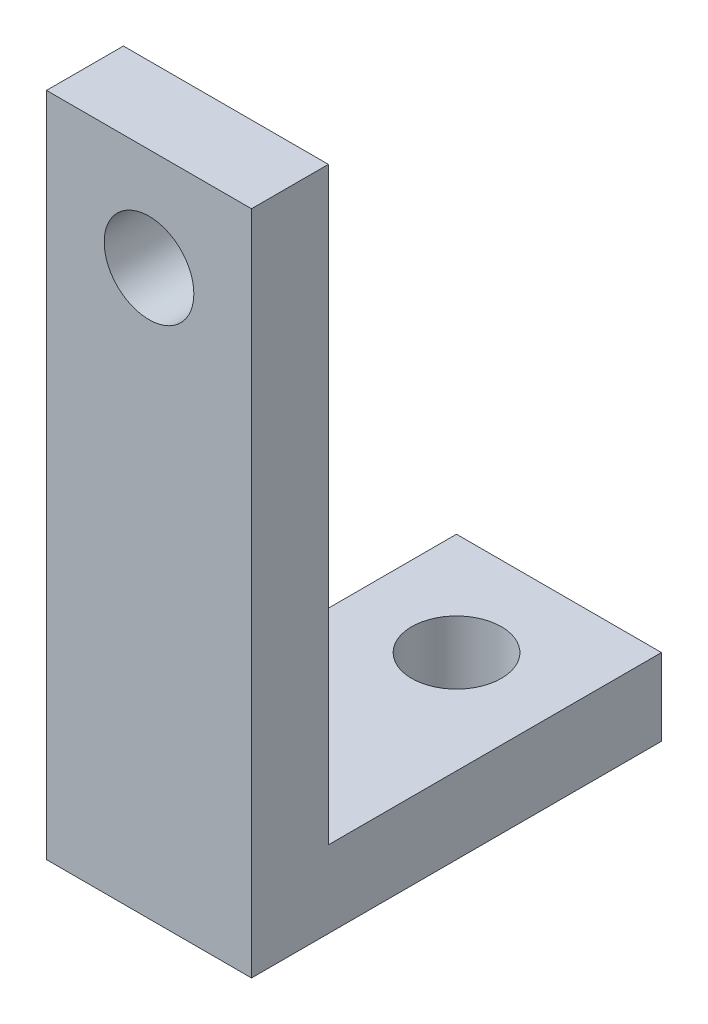
ISO-10303-21;
HEADER;
FILE_DESCRIPTION(('STEP AP214'),'2;1');
FILE_NAME('part.step','',(''),(''),'','','');
FILE_SCHEMA(('AUTOMOTIVE_DESIGN { 1 0 10303 214 1 1 1 1 }'));
ENDSEC;
DATA;
#1=APPLICATION_CONTEXT('core data for automotive mechanical design processes');
#2=APPLICATION_PROTOCOL_DEFINITION('international standard','automotive_design',2000,#1);
#3=PRODUCT_CONTEXT('',#1,'mechanical');
#4=PRODUCT('Part','Part','',(#3));
#5=PRODUCT_RELATED_PRODUCT_CATEGORY('part','',(#4));
#6=PRODUCT_DEFINITION_FORMATION('','',#4);
#7=PRODUCT_DEFINITION_CONTEXT('part definition',#1,'design');
#8=PRODUCT_DEFINITION('design','',#6,#7);
#9=PRODUCT_DEFINITION_SHAPE('','',#8);
#10=(LENGTH_UNIT() NAMED_UNIT(*) SI_UNIT(.MILLI.,.METRE.));
#11=(NAMED_UNIT(*) PLANE_ANGLE_UNIT() SI_UNIT($,.RADIAN.));
#12=(NAMED_UNIT(*) SI_UNIT($,.STERADIAN.) SOLID_ANGLE_UNIT());
#13=UNCERTAINTY_MEASURE_WITH_UNIT(LENGTH_MEASURE(1.E-05),#10,'distance_accuracy_value','');
#14=(GEOMETRIC_REPRESENTATION_CONTEXT(3) GLOBAL_UNCERTAINTY_ASSIGNED_CONTEXT((#13)) GLOBAL_UNIT_ASSIGNED_CONTEXT((#10,
#11,#12)) REPRESENTATION_CONTEXT('',''));
#15=CARTESIAN_POINT('',(0.,0.,0.));
#16=DIRECTION('',(0.,0.,1.));
#17=DIRECTION('',(1.,0.,0.));
#18=AXIS2_PLACEMENT_3D('',#15,#16,#17);
#19=CARTESIAN_POINT('',(0.,0.,0.));
#20=DIRECTION('',(0.,0.,1.));
#21=DIRECTION('',(1.,0.,0.));
#22=AXIS2_PLACEMENT_3D('',#19,#20,#21);
#23=PLANE('',#22);
#24=CARTESIAN_POINT('',(-48.2175292460458,16.1569331292858,0.));
#25=DIRECTION('',(0.,0.,1.));
#26=DIRECTION('',(1.,0.,0.));
#27=AXIS2_PLACEMENT_3D('',#24,#25,#26);
#28=CIRCLE('',#27,1.75);
#29=CARTESIAN_POINT('',(-46.4675292460458,16.1569331292858,0.));
#30=VERTEX_POINT('',#29);
#31=EDGE_CURVE('E148',#30,#30,#28,.T.);
#32=ORIENTED_EDGE('',*,*,#31,.T.);
#33=EDGE_LOOP('',(#32));
#34=FACE_BOUND('',#33,.T.);
#35=DIRECTION('',(1.,0.,0.));
#36=VECTOR('',#35,1.);
#37=CARTESIAN_POINT('',(-44.2175292479687,-2.84306687071421,0.));
#38=LINE('',#37,#36);
#39=CARTESIAN_POINT('',(-52.2175292479687,-2.84306687071421,0.));
#40=VERTEX_POINT('',#39);
#41=CARTESIAN_POINT('',(-44.2175292479687,-2.84306687071421,0.));
#42=VERTEX_POINT('',#41);
#43=EDGE_CURVE('E49',#40,#42,#38,.T.);
#44=ORIENTED_EDGE('',*,*,#43,.F.);
#45=DIRECTION('',(0.,-1.,0.));
#46=VECTOR('',#45,1.);
#47=CARTESIAN_POINT('',(-52.2175292479687,20.15693313,0.));
#48=LINE('',#47,#46);
#49=CARTESIAN_POINT('',(-52.2175292479687,20.15693313,0.));
#50=VERTEX_POINT('',#49);
#51=EDGE_CURVE('E117',#50,#40,#48,.T.);
#52=ORIENTED_EDGE('',*,*,#51,.F.);
#53=DIRECTION('',(-1.,0.,0.));
#54=VECTOR('',#53,1.);
#55=CARTESIAN_POINT('',(-52.2175292479687,20.15693313,0.));
#56=LINE('',#55,#54);
#57=CARTESIAN_POINT('',(-44.2175292479687,20.15693313,0.));
#58=VERTEX_POINT('',#57);
#59=EDGE_CURVE('E73',#58,#50,#56,.T.);
#60=ORIENTED_EDGE('',*,*,#59,.F.);
#61=DIRECTION('',(0.,1.,0.));
#62=VECTOR('',#61,1.);
#63=CARTESIAN_POINT('',(-44.2175292479687,20.15693313,0.));
#64=LINE('',#63,#62);
#65=EDGE_CURVE('E119',#42,#58,#64,.T.);
#66=ORIENTED_EDGE('',*,*,#65,.F.);
#67=EDGE_LOOP('',(#44,#52,#60,#66));
#68=FACE_BOUND('',#67,.T.);
#69=ADVANCED_FACE('F33',(#34,#68),#23,.F.);
#70=CARTESIAN_POINT('',(-52.2175292479687,20.15693313,3.));
#71=DIRECTION('',(1.,0.,0.));
#72=DIRECTION('',(0.,0.,-1.));
#73=AXIS2_PLACEMENT_3D('',#70,#71,#72);
#74=PLANE('',#73);
#75=ORIENTED_EDGE('',*,*,#51,.T.);
#76=DIRECTION('',(0.,0.,1.));
#77=VECTOR('',#76,1.);
#78=CARTESIAN_POINT('',(-52.2175292479687,-2.84306687071421,-13.));
#79=LINE('',#78,#77);
#80=CARTESIAN_POINT('',(-52.2175292479687,-2.84306687071421,-13.));
#81=VERTEX_POINT('',#80);
#82=EDGE_CURVE('E100',#81,#40,#79,.T.);
#83=ORIENTED_EDGE('',*,*,#82,.F.);
#84=DIRECTION('',(0.,1.,0.));
#85=VECTOR('',#84,1.);
#86=CARTESIAN_POINT('',(-52.2175292479687,-2.84306687071421,-13.));
#87=LINE('',#86,#85);
#88=CARTESIAN_POINT('',(-52.2175292479687,-5.84306687071421,-13.));
#89=VERTEX_POINT('',#88);
#90=EDGE_CURVE('E107',#89,#81,#87,.T.);
#91=ORIENTED_EDGE('',*,*,#90,.F.);
#92=DIRECTION('',(0.,0.,-1.));
#93=VECTOR('',#92,1.);
#94=CARTESIAN_POINT('',(-52.2175292479687,-5.84306687071421,3.));
#95=LINE('',#94,#93);
#96=CARTESIAN_POINT('',(-52.2175292479687,-5.84306687071421,3.));
#97=VERTEX_POINT('',#96);
#98=EDGE_CURVE('E11',#97,#89,#95,.T.);
#99=ORIENTED_EDGE('',*,*,#98,.F.);
#100=DIRECTION('',(0.,-1.,0.));
#101=VECTOR('',#100,1.);
#102=CARTESIAN_POINT('',(-52.2175292479687,20.15693313,3.));
#103=LINE('',#102,#101);
#104=CARTESIAN_POINT('',(-52.2175292479687,20.15693313,3.));
#105=VERTEX_POINT('',#104);
#106=EDGE_CURVE('E124',#105,#97,#103,.T.);
#107=ORIENTED_EDGE('',*,*,#106,.F.);
#108=DIRECTION('',(0.,0.,-1.));
#109=VECTOR('',#108,1.);
#110=CARTESIAN_POINT('',(-52.2175292479687,20.15693313,3.));
#111=LINE('',#110,#109);
#112=EDGE_CURVE('E129',#105,#50,#111,.T.);
#113=ORIENTED_EDGE('',*,*,#112,.T.);
#114=EDGE_LOOP('',(#75,#83,#91,#99,#107,#113));
#115=FACE_BOUND('',#114,.T.);
#116=ADVANCED_FACE('F35',(#115),#74,.F.);
#117=CARTESIAN_POINT('',(-52.2175292479687,-5.84306687071421,3.));
#118=DIRECTION('',(0.,1.,0.));
#119=DIRECTION('',(0.,0.,1.));
#120=AXIS2_PLACEMENT_3D('',#117,#118,#119);
#121=PLANE('',#120);
#122=CARTESIAN_POINT('',(-48.2175292479688,-5.84306687071421,-8.99999999999995));
#123=DIRECTION('',(0.,-1.,0.));
#124=DIRECTION('',(0.,0.,-1.));
#125=AXIS2_PLACEMENT_3D('',#122,#123,#124);
#126=CIRCLE('',#125,1.75);
#127=CARTESIAN_POINT('',(-48.2175292479688,-5.84306687071421,-10.75));
#128=VERTEX_POINT('',#127);
#129=EDGE_CURVE('E144',#128,#128,#126,.T.);
#130=ORIENTED_EDGE('',*,*,#129,.F.);
#131=EDGE_LOOP('',(#130));
#132=FACE_BOUND('',#131,.T.);
#133=ORIENTED_EDGE('',*,*,#98,.T.);
#134=DIRECTION('',(-1.,0.,0.));
#135=VECTOR('',#134,1.);
#136=CARTESIAN_POINT('',(-52.2175292479687,-5.84306687071421,-13.));
#137=LINE('',#136,#135);
#138=CARTESIAN_POINT('',(-44.2175292479687,-5.84306687071421,-13.));
#139=VERTEX_POINT('',#138);
#140=EDGE_CURVE('E113',#139,#89,#137,.T.);
#141=ORIENTED_EDGE('',*,*,#140,.F.);
#142=DIRECTION('',(0.,0.,-1.));
#143=VECTOR('',#142,1.);
#144=CARTESIAN_POINT('',(-44.2175292479687,-5.84306687071421,3.));
#145=LINE('',#144,#143);
#146=CARTESIAN_POINT('',(-44.2175292479687,-5.84306687071421,3.));
#147=VERTEX_POINT('',#146);
#148=EDGE_CURVE('E42',#147,#139,#145,.T.);
#149=ORIENTED_EDGE('',*,*,#148,.F.);
#150=DIRECTION('',(1.,0.,0.));
#151=VECTOR('',#150,1.);
#152=CARTESIAN_POINT('',(-52.2175292479687,-5.84306687071421,3.));
#153=LINE('',#152,#151);
#154=EDGE_CURVE('E80',#97,#147,#153,.T.);
#155=ORIENTED_EDGE('',*,*,#154,.F.);
#156=EDGE_LOOP('',(#133,#141,#149,#155));
#157=FACE_BOUND('',#156,.T.);
#158=ADVANCED_FACE('F141',(#132,#157),#121,.F.);
#159=CARTESIAN_POINT('',(-44.2175292479687,20.15693313,3.));
#160=DIRECTION('',(-1.,0.,0.));
#161=DIRECTION('',(0.,0.,1.));
#162=AXIS2_PLACEMENT_3D('',#159,#160,#161);
#163=PLANE('',#162);
#164=ORIENTED_EDGE('',*,*,#148,.T.);
#165=DIRECTION('',(0.,-1.,0.));
#166=VECTOR('',#165,1.);
#167=CARTESIAN_POINT('',(-44.2175292479687,-5.84306687071421,-13.));
#168=LINE('',#167,#166);
#169=CARTESIAN_POINT('',(-44.2175292479687,-2.84306687071421,-13.));
#170=VERTEX_POINT('',#169);
#171=EDGE_CURVE('E106',#170,#139,#168,.T.);
#172=ORIENTED_EDGE('',*,*,#171,.F.);
#173=DIRECTION('',(0.,0.,1.));
#174=VECTOR('',#173,1.);
#175=CARTESIAN_POINT('',(-44.2175292479687,-2.84306687071421,-13.));
#176=LINE('',#175,#174);
#177=EDGE_CURVE('E102',#170,#42,#176,.T.);
#178=ORIENTED_EDGE('',*,*,#177,.T.);
#179=ORIENTED_EDGE('',*,*,#65,.T.);
#180=DIRECTION('',(0.,0.,-1.));
#181=VECTOR('',#180,1.);
#182=CARTESIAN_POINT('',(-44.2175292479687,20.15693313,3.));
#183=LINE('',#182,#181);
#184=CARTESIAN_POINT('',(-44.2175292479687,20.15693313,3.));
#185=VERTEX_POINT('',#184);
#186=EDGE_CURVE('E134',#185,#58,#183,.T.);
#187=ORIENTED_EDGE('',*,*,#186,.F.);
#188=DIRECTION('',(0.,1.,0.));
#189=VECTOR('',#188,1.);
#190=CARTESIAN_POINT('',(-44.2175292479687,20.15693313,3.));
#191=LINE('',#190,#189);
#192=EDGE_CURVE('E127',#147,#185,#191,.T.);
#193=ORIENTED_EDGE('',*,*,#192,.F.);
#194=EDGE_LOOP('',(#164,#172,#178,#179,#187,#193));
#195=FACE_BOUND('',#194,.T.);
#196=ADVANCED_FACE('F138',(#195),#163,.F.);
#197=CARTESIAN_POINT('',(-52.2175292479687,20.15693313,3.));
#198=DIRECTION('',(0.,-1.,0.));
#199=DIRECTION('',(0.,0.,-1.));
#200=AXIS2_PLACEMENT_3D('',#197,#198,#199);
#201=PLANE('',#200);
#202=ORIENTED_EDGE('',*,*,#59,.T.);
#203=ORIENTED_EDGE('',*,*,#112,.F.);
#204=DIRECTION('',(-1.,0.,0.));
#205=VECTOR('',#204,1.);
#206=CARTESIAN_POINT('',(-52.2175292479687,20.15693313,3.));
#207=LINE('',#206,#205);
#208=EDGE_CURVE('E58',#185,#105,#207,.T.);
#209=ORIENTED_EDGE('',*,*,#208,.F.);
#210=ORIENTED_EDGE('',*,*,#186,.T.);
#211=EDGE_LOOP('',(#202,#203,#209,#210));
#212=FACE_BOUND('',#211,.T.);
#213=ADVANCED_FACE('F164',(#212),#201,.F.);
#214=CARTESIAN_POINT('',(0.,0.,3.));
#215=DIRECTION('',(0.,0.,1.));
#216=DIRECTION('',(1.,0.,0.));
#217=AXIS2_PLACEMENT_3D('',#214,#215,#216);
#218=PLANE('',#217);
#219=CARTESIAN_POINT('',(-48.2175292460458,16.1569331292858,3.));
#220=DIRECTION('',(0.,0.,1.));
#221=DIRECTION('',(1.,0.,0.));
#222=AXIS2_PLACEMENT_3D('',#219,#220,#221);
#223=CIRCLE('',#222,1.75);
#224=CARTESIAN_POINT('',(-46.4675292460458,16.1569331292858,3.));
#225=VERTEX_POINT('',#224);
#226=EDGE_CURVE('E153',#225,#225,#223,.T.);
#227=ORIENTED_EDGE('',*,*,#226,.F.);
#228=EDGE_LOOP('',(#227));
#229=FACE_BOUND('',#228,.T.);
#230=ORIENTED_EDGE('',*,*,#106,.T.);
#231=ORIENTED_EDGE('',*,*,#154,.T.);
#232=ORIENTED_EDGE('',*,*,#192,.T.);
#233=ORIENTED_EDGE('',*,*,#208,.T.);
#234=EDGE_LOOP('',(#230,#231,#232,#233));
#235=FACE_BOUND('',#234,.T.);
#236=ADVANCED_FACE('F162',(#229,#235),#218,.T.);
#237=CARTESIAN_POINT('',(-44.2175292479687,-2.84306687071421,-13.));
#238=DIRECTION('',(0.,-1.,0.));
#239=DIRECTION('',(1.,0.,0.));
#240=AXIS2_PLACEMENT_3D('',#237,#238,#239);
#241=PLANE('',#240);
#242=CARTESIAN_POINT('',(-48.2175292479688,-2.84306687071421,-8.99999999999995));
#243=DIRECTION('',(0.,-1.,0.));
#244=DIRECTION('',(1.,0.,0.));
#245=AXIS2_PLACEMENT_3D('',#242,#243,#244);
#246=CIRCLE('',#245,1.75);
#247=CARTESIAN_POINT('',(-46.4675292479688,-2.84306687071421,-8.99999999999995));
#248=VERTEX_POINT('',#247);
#249=EDGE_CURVE('E37',#248,#248,#246,.T.);
#250=ORIENTED_EDGE('',*,*,#249,.T.);
#251=EDGE_LOOP('',(#250));
#252=FACE_BOUND('',#251,.T.);
#253=ORIENTED_EDGE('',*,*,#43,.T.);
#254=ORIENTED_EDGE('',*,*,#177,.F.);
#255=DIRECTION('',(1.,0.,0.));
#256=VECTOR('',#255,1.);
#257=CARTESIAN_POINT('',(-44.2175292479687,-2.84306687071421,-13.));
#258=LINE('',#257,#256);
#259=EDGE_CURVE('E96',#81,#170,#258,.T.);
#260=ORIENTED_EDGE('',*,*,#259,.F.);
#261=ORIENTED_EDGE('',*,*,#82,.T.);
#262=EDGE_LOOP('',(#253,#254,#260,#261));
#263=FACE_BOUND('',#262,.T.);
#264=ADVANCED_FACE('F98',(#252,#263),#241,.F.);
#265=CARTESIAN_POINT('',(0.,0.,-13.));
#266=DIRECTION('',(0.,0.,1.));
#267=DIRECTION('',(1.,0.,0.));
#268=AXIS2_PLACEMENT_3D('',#265,#266,#267);
#269=PLANE('',#268);
#270=ORIENTED_EDGE('',*,*,#90,.T.);
#271=ORIENTED_EDGE('',*,*,#259,.T.);
#272=ORIENTED_EDGE('',*,*,#171,.T.);
#273=ORIENTED_EDGE('',*,*,#140,.T.);
#274=EDGE_LOOP('',(#270,#271,#272,#273));
#275=FACE_BOUND('',#274,.T.);
#276=ADVANCED_FACE('F111',(#275),#269,.F.);
#277=CARTESIAN_POINT('',(-48.2175292479688,2.15693312928579,-8.99999999999995));
#278=DIRECTION('',(0.,-1.,0.));
#279=DIRECTION('',(0.,0.,-1.));
#280=AXIS2_PLACEMENT_3D('',#277,#278,#279);
#281=CYLINDRICAL_SURFACE('',#280,1.75);
#282=ORIENTED_EDGE('',*,*,#129,.T.);
#283=EDGE_LOOP('',(#282));
#284=FACE_BOUND('',#283,.T.);
#285=ORIENTED_EDGE('',*,*,#249,.F.);
#286=EDGE_LOOP('',(#285));
#287=FACE_BOUND('',#286,.T.);
#288=ADVANCED_FACE('F184',(#284,#287),#281,.F.);
#289=CARTESIAN_POINT('',(-48.2175292460458,16.1569331292858,-5.));
#290=DIRECTION('',(0.,0.,1.));
#291=DIRECTION('',(1.,0.,0.));
#292=AXIS2_PLACEMENT_3D('',#289,#290,#291);
#293=CYLINDRICAL_SURFACE('',#292,1.75);
#294=ORIENTED_EDGE('',*,*,#226,.T.);
#295=EDGE_LOOP('',(#294));
#296=FACE_BOUND('',#295,.T.);
#297=ORIENTED_EDGE('',*,*,#31,.F.);
#298=EDGE_LOOP('',(#297));
#299=FACE_BOUND('',#298,.T.);
#300=ADVANCED_FACE('F159',(#296,#299),#293,.F.);
#301=CLOSED_SHELL('',(#69,#116,#158,#196,#213,#236,#264,#276,#288,#300));
#302=MANIFOLD_SOLID_BREP('B2',#301);
#303=ADVANCED_BREP_SHAPE_REPRESENTATION('',(#18,#302),#14);
#304=SHAPE_DEFINITION_REPRESENTATION(#9,#303);
ENDSEC;
END-ISO-10303-21;
